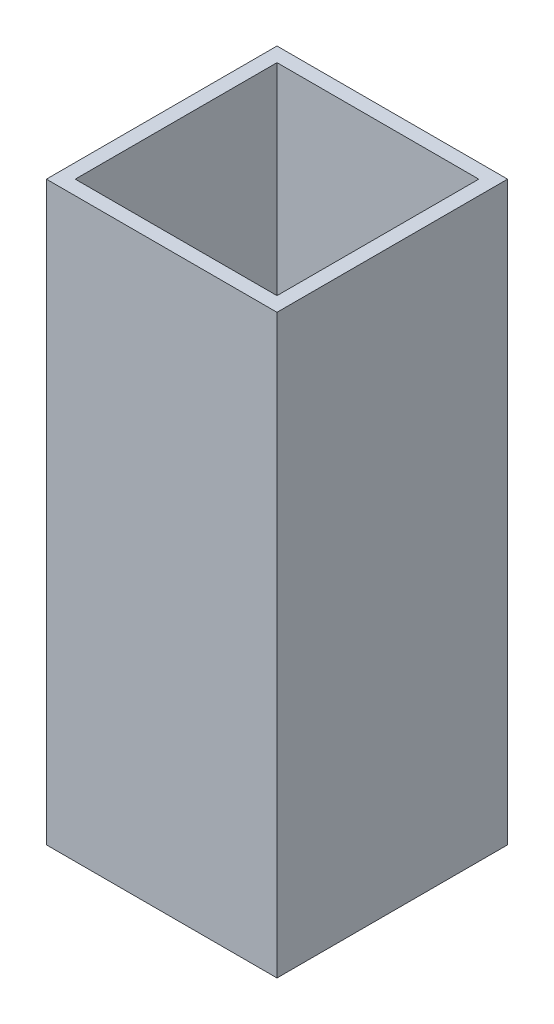
ISO-10303-21;
HEADER;
FILE_DESCRIPTION(('STEP AP214'),'2;1');
FILE_NAME('part.step','',(''),(''),'','','');
FILE_SCHEMA(('AUTOMOTIVE_DESIGN { 1 0 10303 214 1 1 1 1 }'));
ENDSEC;
DATA;
#1=APPLICATION_CONTEXT('core data for automotive mechanical design processes');
#2=APPLICATION_PROTOCOL_DEFINITION('international standard','automotive_design',2000,#1);
#3=PRODUCT_CONTEXT('',#1,'mechanical');
#4=PRODUCT('Part','Part','',(#3));
#5=PRODUCT_RELATED_PRODUCT_CATEGORY('part','',(#4));
#6=PRODUCT_DEFINITION_FORMATION('','',#4);
#7=PRODUCT_DEFINITION_CONTEXT('part definition',#1,'design');
#8=PRODUCT_DEFINITION('design','',#6,#7);
#9=PRODUCT_DEFINITION_SHAPE('','',#8);
#10=(LENGTH_UNIT() NAMED_UNIT(*) SI_UNIT(.MILLI.,.METRE.));
#11=(NAMED_UNIT(*) PLANE_ANGLE_UNIT() SI_UNIT($,.RADIAN.));
#12=(NAMED_UNIT(*) SI_UNIT($,.STERADIAN.) SOLID_ANGLE_UNIT());
#13=UNCERTAINTY_MEASURE_WITH_UNIT(LENGTH_MEASURE(1.E-05),#10,'distance_accuracy_value','');
#14=(GEOMETRIC_REPRESENTATION_CONTEXT(3) GLOBAL_UNCERTAINTY_ASSIGNED_CONTEXT((#13)) GLOBAL_UNIT_ASSIGNED_CONTEXT((#10,
#11,#12)) REPRESENTATION_CONTEXT('',''));
#15=CARTESIAN_POINT('',(0.,0.,0.));
#16=DIRECTION('',(0.,0.,1.));
#17=DIRECTION('',(1.,0.,0.));
#18=AXIS2_PLACEMENT_3D('',#15,#16,#17);
#19=CARTESIAN_POINT('',(0.,63.5,0.));
#20=DIRECTION('',(0.,-1.,0.));
#21=DIRECTION('',(0.,0.,-1.));
#22=AXIS2_PLACEMENT_3D('',#19,#20,#21);
#23=PLANE('',#22);
#24=DIRECTION('',(0.,0.,1.));
#25=VECTOR('',#24,1.);
#26=CARTESIAN_POINT('',(-12.7,63.5,-12.7));
#27=LINE('',#26,#25);
#28=CARTESIAN_POINT('',(-12.7,63.5,-12.7));
#29=VERTEX_POINT('',#28);
#30=CARTESIAN_POINT('',(-12.7,63.5,12.7));
#31=VERTEX_POINT('',#30);
#32=EDGE_CURVE('E136',#29,#31,#27,.T.);
#33=ORIENTED_EDGE('',*,*,#32,.T.);
#34=DIRECTION('',(1.,0.,0.));
#35=VECTOR('',#34,1.);
#36=CARTESIAN_POINT('',(12.7,63.5,12.7));
#37=LINE('',#36,#35);
#38=CARTESIAN_POINT('',(12.7,63.5,12.7));
#39=VERTEX_POINT('',#38);
#40=EDGE_CURVE('E139',#31,#39,#37,.T.);
#41=ORIENTED_EDGE('',*,*,#40,.T.);
#42=DIRECTION('',(0.,0.,-1.));
#43=VECTOR('',#42,1.);
#44=CARTESIAN_POINT('',(12.7,63.5,-12.7));
#45=LINE('',#44,#43);
#46=CARTESIAN_POINT('',(12.7,63.5,-12.7));
#47=VERTEX_POINT('',#46);
#48=EDGE_CURVE('E142',#39,#47,#45,.T.);
#49=ORIENTED_EDGE('',*,*,#48,.T.);
#50=DIRECTION('',(-1.,0.,0.));
#51=VECTOR('',#50,1.);
#52=CARTESIAN_POINT('',(12.7,63.5,-12.7));
#53=LINE('',#52,#51);
#54=EDGE_CURVE('E144',#47,#29,#53,.T.);
#55=ORIENTED_EDGE('',*,*,#54,.T.);
#56=EDGE_LOOP('',(#33,#41,#49,#55));
#57=FACE_BOUND('',#56,.T.);
#58=DIRECTION('',(0.,0.,1.));
#59=VECTOR('',#58,1.);
#60=CARTESIAN_POINT('',(-11.1125,63.5,-11.1125));
#61=LINE('',#60,#59);
#62=CARTESIAN_POINT('',(-11.1125,63.5,-11.1125));
#63=VERTEX_POINT('',#62);
#64=CARTESIAN_POINT('',(-11.1125,63.5,11.1125));
#65=VERTEX_POINT('',#64);
#66=EDGE_CURVE('E100',#63,#65,#61,.T.);
#67=ORIENTED_EDGE('',*,*,#66,.F.);
#68=DIRECTION('',(-1.,0.,0.));
#69=VECTOR('',#68,1.);
#70=CARTESIAN_POINT('',(11.1125,63.5,-11.1125));
#71=LINE('',#70,#69);
#72=CARTESIAN_POINT('',(11.1125,63.5,-11.1125));
#73=VERTEX_POINT('',#72);
#74=EDGE_CURVE('E122',#73,#63,#71,.T.);
#75=ORIENTED_EDGE('',*,*,#74,.F.);
#76=DIRECTION('',(0.,0.,-1.));
#77=VECTOR('',#76,1.);
#78=CARTESIAN_POINT('',(11.1125,63.5,-11.1125));
#79=LINE('',#78,#77);
#80=CARTESIAN_POINT('',(11.1125,63.5,11.1125));
#81=VERTEX_POINT('',#80);
#82=EDGE_CURVE('E120',#81,#73,#79,.T.);
#83=ORIENTED_EDGE('',*,*,#82,.F.);
#84=DIRECTION('',(1.,0.,0.));
#85=VECTOR('',#84,1.);
#86=CARTESIAN_POINT('',(11.1125,63.5,11.1125));
#87=LINE('',#86,#85);
#88=EDGE_CURVE('E108',#65,#81,#87,.T.);
#89=ORIENTED_EDGE('',*,*,#88,.F.);
#90=EDGE_LOOP('',(#67,#75,#83,#89));
#91=FACE_BOUND('',#90,.T.);
#92=ADVANCED_FACE('F35',(#57,#91),#23,.F.);
#93=CARTESIAN_POINT('',(0.,0.,0.));
#94=DIRECTION('',(0.,-1.,0.));
#95=DIRECTION('',(0.,0.,-1.));
#96=AXIS2_PLACEMENT_3D('',#93,#94,#95);
#97=PLANE('',#96);
#98=DIRECTION('',(0.,0.,1.));
#99=VECTOR('',#98,1.);
#100=CARTESIAN_POINT('',(-12.7,0.,-12.7));
#101=LINE('',#100,#99);
#102=CARTESIAN_POINT('',(-12.7,0.,-12.7));
#103=VERTEX_POINT('',#102);
#104=CARTESIAN_POINT('',(-12.7,0.,12.7));
#105=VERTEX_POINT('',#104);
#106=EDGE_CURVE('E116',#103,#105,#101,.T.);
#107=ORIENTED_EDGE('',*,*,#106,.F.);
#108=DIRECTION('',(-1.,0.,0.));
#109=VECTOR('',#108,1.);
#110=CARTESIAN_POINT('',(12.7,0.,-12.7));
#111=LINE('',#110,#109);
#112=CARTESIAN_POINT('',(12.7,0.,-12.7));
#113=VERTEX_POINT('',#112);
#114=EDGE_CURVE('E140',#113,#103,#111,.T.);
#115=ORIENTED_EDGE('',*,*,#114,.F.);
#116=DIRECTION('',(0.,0.,-1.));
#117=VECTOR('',#116,1.);
#118=CARTESIAN_POINT('',(12.7,0.,-12.7));
#119=LINE('',#118,#117);
#120=CARTESIAN_POINT('',(12.7,0.,12.7));
#121=VERTEX_POINT('',#120);
#122=EDGE_CURVE('E151',#121,#113,#119,.T.);
#123=ORIENTED_EDGE('',*,*,#122,.F.);
#124=DIRECTION('',(1.,0.,0.));
#125=VECTOR('',#124,1.);
#126=CARTESIAN_POINT('',(12.7,0.,12.7));
#127=LINE('',#126,#125);
#128=EDGE_CURVE('E149',#105,#121,#127,.T.);
#129=ORIENTED_EDGE('',*,*,#128,.F.);
#130=EDGE_LOOP('',(#107,#115,#123,#129));
#131=FACE_BOUND('',#130,.T.);
#132=DIRECTION('',(-1.,0.,0.));
#133=VECTOR('',#132,1.);
#134=CARTESIAN_POINT('',(11.1125,0.,-11.1125));
#135=LINE('',#134,#133);
#136=CARTESIAN_POINT('',(11.1125,0.,-11.1125));
#137=VERTEX_POINT('',#136);
#138=CARTESIAN_POINT('',(-11.1125,0.,-11.1125));
#139=VERTEX_POINT('',#138);
#140=EDGE_CURVE('E109',#137,#139,#135,.T.);
#141=ORIENTED_EDGE('',*,*,#140,.T.);
#142=DIRECTION('',(0.,0.,1.));
#143=VECTOR('',#142,1.);
#144=CARTESIAN_POINT('',(-11.1125,0.,-11.1125));
#145=LINE('',#144,#143);
#146=CARTESIAN_POINT('',(-11.1125,0.,11.1125));
#147=VERTEX_POINT('',#146);
#148=EDGE_CURVE('E58',#139,#147,#145,.T.);
#149=ORIENTED_EDGE('',*,*,#148,.T.);
#150=DIRECTION('',(1.,0.,0.));
#151=VECTOR('',#150,1.);
#152=CARTESIAN_POINT('',(11.1125,0.,11.1125));
#153=LINE('',#152,#151);
#154=CARTESIAN_POINT('',(11.1125,0.,11.1125));
#155=VERTEX_POINT('',#154);
#156=EDGE_CURVE('E115',#147,#155,#153,.T.);
#157=ORIENTED_EDGE('',*,*,#156,.T.);
#158=DIRECTION('',(0.,0.,-1.));
#159=VECTOR('',#158,1.);
#160=CARTESIAN_POINT('',(11.1125,0.,-11.1125));
#161=LINE('',#160,#159);
#162=EDGE_CURVE('E128',#155,#137,#161,.T.);
#163=ORIENTED_EDGE('',*,*,#162,.T.);
#164=EDGE_LOOP('',(#141,#149,#157,#163));
#165=FACE_BOUND('',#164,.T.);
#166=ADVANCED_FACE('F169',(#131,#165),#97,.T.);
#167=CARTESIAN_POINT('',(-12.7,63.5,-12.7));
#168=DIRECTION('',(1.,0.,0.));
#169=DIRECTION('',(0.,0.,-1.));
#170=AXIS2_PLACEMENT_3D('',#167,#168,#169);
#171=PLANE('',#170);
#172=ORIENTED_EDGE('',*,*,#106,.T.);
#173=DIRECTION('',(0.,-1.,0.));
#174=VECTOR('',#173,1.);
#175=CARTESIAN_POINT('',(-12.7,63.5,12.7));
#176=LINE('',#175,#174);
#177=EDGE_CURVE('E11',#31,#105,#176,.T.);
#178=ORIENTED_EDGE('',*,*,#177,.F.);
#179=ORIENTED_EDGE('',*,*,#32,.F.);
#180=DIRECTION('',(0.,-1.,0.));
#181=VECTOR('',#180,1.);
#182=CARTESIAN_POINT('',(-12.7,63.5,-12.7));
#183=LINE('',#182,#181);
#184=EDGE_CURVE('E146',#29,#103,#183,.T.);
#185=ORIENTED_EDGE('',*,*,#184,.T.);
#186=EDGE_LOOP('',(#172,#178,#179,#185));
#187=FACE_BOUND('',#186,.T.);
#188=ADVANCED_FACE('F37',(#187),#171,.F.);
#189=CARTESIAN_POINT('',(12.7,63.5,12.7));
#190=DIRECTION('',(0.,0.,-1.));
#191=DIRECTION('',(-1.,0.,0.));
#192=AXIS2_PLACEMENT_3D('',#189,#190,#191);
#193=PLANE('',#192);
#194=ORIENTED_EDGE('',*,*,#128,.T.);
#195=DIRECTION('',(0.,-1.,0.));
#196=VECTOR('',#195,1.);
#197=CARTESIAN_POINT('',(12.7,63.5,12.7));
#198=LINE('',#197,#196);
#199=EDGE_CURVE('E43',#39,#121,#198,.T.);
#200=ORIENTED_EDGE('',*,*,#199,.F.);
#201=ORIENTED_EDGE('',*,*,#40,.F.);
#202=ORIENTED_EDGE('',*,*,#177,.T.);
#203=EDGE_LOOP('',(#194,#200,#201,#202));
#204=FACE_BOUND('',#203,.T.);
#205=ADVANCED_FACE('F179',(#204),#193,.F.);
#206=CARTESIAN_POINT('',(12.7,63.5,-12.7));
#207=DIRECTION('',(-1.,0.,0.));
#208=DIRECTION('',(0.,0.,1.));
#209=AXIS2_PLACEMENT_3D('',#206,#207,#208);
#210=PLANE('',#209);
#211=ORIENTED_EDGE('',*,*,#122,.T.);
#212=DIRECTION('',(0.,-1.,0.));
#213=VECTOR('',#212,1.);
#214=CARTESIAN_POINT('',(12.7,63.5,-12.7));
#215=LINE('',#214,#213);
#216=EDGE_CURVE('E156',#47,#113,#215,.T.);
#217=ORIENTED_EDGE('',*,*,#216,.F.);
#218=ORIENTED_EDGE('',*,*,#48,.F.);
#219=ORIENTED_EDGE('',*,*,#199,.T.);
#220=EDGE_LOOP('',(#211,#217,#218,#219));
#221=FACE_BOUND('',#220,.T.);
#222=ADVANCED_FACE('F163',(#221),#210,.F.);
#223=CARTESIAN_POINT('',(12.7,63.5,-12.7));
#224=DIRECTION('',(0.,0.,1.));
#225=DIRECTION('',(1.,0.,0.));
#226=AXIS2_PLACEMENT_3D('',#223,#224,#225);
#227=PLANE('',#226);
#228=ORIENTED_EDGE('',*,*,#114,.T.);
#229=ORIENTED_EDGE('',*,*,#184,.F.);
#230=ORIENTED_EDGE('',*,*,#54,.F.);
#231=ORIENTED_EDGE('',*,*,#216,.T.);
#232=EDGE_LOOP('',(#228,#229,#230,#231));
#233=FACE_BOUND('',#232,.T.);
#234=ADVANCED_FACE('F173',(#233),#227,.F.);
#235=CARTESIAN_POINT('',(-11.1125,63.5,-11.1125));
#236=DIRECTION('',(1.,0.,0.));
#237=DIRECTION('',(0.,0.,-1.));
#238=AXIS2_PLACEMENT_3D('',#235,#236,#237);
#239=PLANE('',#238);
#240=ORIENTED_EDGE('',*,*,#148,.F.);
#241=DIRECTION('',(0.,-1.,0.));
#242=VECTOR('',#241,1.);
#243=CARTESIAN_POINT('',(-11.1125,63.5,-11.1125));
#244=LINE('',#243,#242);
#245=EDGE_CURVE('E104',#63,#139,#244,.T.);
#246=ORIENTED_EDGE('',*,*,#245,.F.);
#247=ORIENTED_EDGE('',*,*,#66,.T.);
#248=DIRECTION('',(0.,-1.,0.));
#249=VECTOR('',#248,1.);
#250=CARTESIAN_POINT('',(-11.1125,63.5,11.1125));
#251=LINE('',#250,#249);
#252=EDGE_CURVE('E103',#65,#147,#251,.T.);
#253=ORIENTED_EDGE('',*,*,#252,.T.);
#254=EDGE_LOOP('',(#240,#246,#247,#253));
#255=FACE_BOUND('',#254,.T.);
#256=ADVANCED_FACE('F102',(#255),#239,.T.);
#257=CARTESIAN_POINT('',(11.1125,63.5,11.1125));
#258=DIRECTION('',(0.,0.,-1.));
#259=DIRECTION('',(-1.,0.,0.));
#260=AXIS2_PLACEMENT_3D('',#257,#258,#259);
#261=PLANE('',#260);
#262=ORIENTED_EDGE('',*,*,#156,.F.);
#263=ORIENTED_EDGE('',*,*,#252,.F.);
#264=ORIENTED_EDGE('',*,*,#88,.T.);
#265=DIRECTION('',(0.,-1.,0.));
#266=VECTOR('',#265,1.);
#267=CARTESIAN_POINT('',(11.1125,63.5,11.1125));
#268=LINE('',#267,#266);
#269=EDGE_CURVE('E117',#81,#155,#268,.T.);
#270=ORIENTED_EDGE('',*,*,#269,.T.);
#271=EDGE_LOOP('',(#262,#263,#264,#270));
#272=FACE_BOUND('',#271,.T.);
#273=ADVANCED_FACE('F112',(#272),#261,.T.);
#274=CARTESIAN_POINT('',(11.1125,63.5,-11.1125));
#275=DIRECTION('',(-1.,0.,0.));
#276=DIRECTION('',(0.,0.,1.));
#277=AXIS2_PLACEMENT_3D('',#274,#275,#276);
#278=PLANE('',#277);
#279=ORIENTED_EDGE('',*,*,#162,.F.);
#280=ORIENTED_EDGE('',*,*,#269,.F.);
#281=ORIENTED_EDGE('',*,*,#82,.T.);
#282=DIRECTION('',(0.,-1.,0.));
#283=VECTOR('',#282,1.);
#284=CARTESIAN_POINT('',(11.1125,63.5,-11.1125));
#285=LINE('',#284,#283);
#286=EDGE_CURVE('E50',#73,#137,#285,.T.);
#287=ORIENTED_EDGE('',*,*,#286,.T.);
#288=EDGE_LOOP('',(#279,#280,#281,#287));
#289=FACE_BOUND('',#288,.T.);
#290=ADVANCED_FACE('F202',(#289),#278,.T.);
#291=CARTESIAN_POINT('',(11.1125,63.5,-11.1125));
#292=DIRECTION('',(0.,0.,1.));
#293=DIRECTION('',(1.,0.,0.));
#294=AXIS2_PLACEMENT_3D('',#291,#292,#293);
#295=PLANE('',#294);
#296=ORIENTED_EDGE('',*,*,#140,.F.);
#297=ORIENTED_EDGE('',*,*,#286,.F.);
#298=ORIENTED_EDGE('',*,*,#74,.T.);
#299=ORIENTED_EDGE('',*,*,#245,.T.);
#300=EDGE_LOOP('',(#296,#297,#298,#299));
#301=FACE_BOUND('',#300,.T.);
#302=ADVANCED_FACE('F206',(#301),#295,.T.);
#303=CLOSED_SHELL('',(#92,#166,#188,#205,#222,#234,#256,#273,#290,#302));
#304=MANIFOLD_SOLID_BREP('B2',#303);
#305=ADVANCED_BREP_SHAPE_REPRESENTATION('',(#18,#304),#14);
#306=SHAPE_DEFINITION_REPRESENTATION(#9,#305);
ENDSEC;
END-ISO-10303-21;
